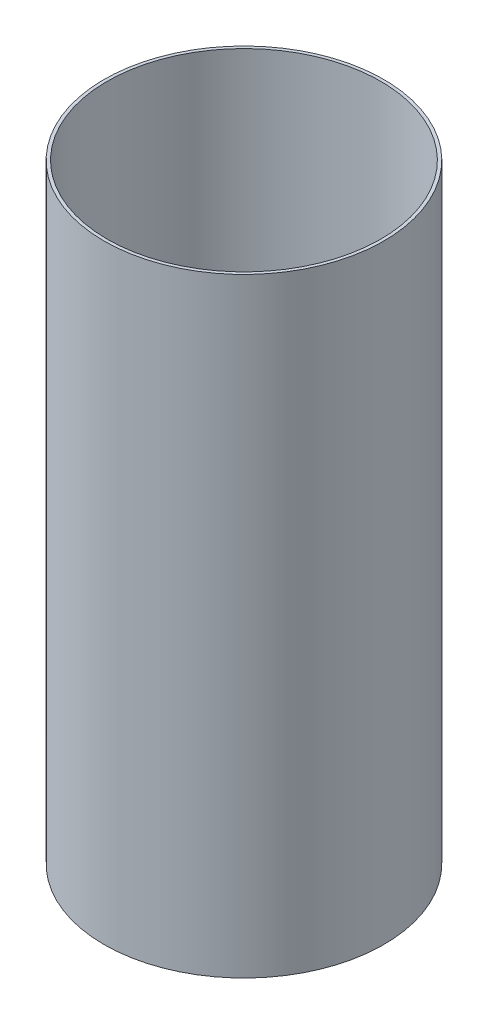
ISO-10303-21;
HEADER;
FILE_DESCRIPTION(('STEP AP214'),'2;1');
FILE_NAME('part.step','',(''),(''),'','','');
FILE_SCHEMA(('AUTOMOTIVE_DESIGN { 1 0 10303 214 1 1 1 1 }'));
ENDSEC;
DATA;
#1=APPLICATION_CONTEXT('core data for automotive mechanical design processes');
#2=APPLICATION_PROTOCOL_DEFINITION('international standard','automotive_design',2000,#1);
#3=PRODUCT_CONTEXT('',#1,'mechanical');
#4=PRODUCT('Part','Part','',(#3));
#5=PRODUCT_RELATED_PRODUCT_CATEGORY('part','',(#4));
#6=PRODUCT_DEFINITION_FORMATION('','',#4);
#7=PRODUCT_DEFINITION_CONTEXT('part definition',#1,'design');
#8=PRODUCT_DEFINITION('design','',#6,#7);
#9=PRODUCT_DEFINITION_SHAPE('','',#8);
#10=(LENGTH_UNIT() NAMED_UNIT(*) SI_UNIT(.MILLI.,.METRE.));
#11=(NAMED_UNIT(*) PLANE_ANGLE_UNIT() SI_UNIT($,.RADIAN.));
#12=(NAMED_UNIT(*) SI_UNIT($,.STERADIAN.) SOLID_ANGLE_UNIT());
#13=UNCERTAINTY_MEASURE_WITH_UNIT(LENGTH_MEASURE(1.E-05),#10,'distance_accuracy_value','');
#14=(GEOMETRIC_REPRESENTATION_CONTEXT(3) GLOBAL_UNCERTAINTY_ASSIGNED_CONTEXT((#13)) GLOBAL_UNIT_ASSIGNED_CONTEXT((#10,
#11,#12)) REPRESENTATION_CONTEXT('',''));
#15=CARTESIAN_POINT('',(0.,0.,0.));
#16=DIRECTION('',(0.,0.,1.));
#17=DIRECTION('',(1.,0.,0.));
#18=AXIS2_PLACEMENT_3D('',#15,#16,#17);
#19=CARTESIAN_POINT('',(0.,98.,0.));
#20=DIRECTION('',(0.,-1.,0.));
#21=DIRECTION('',(0.,0.,-1.));
#22=AXIS2_PLACEMENT_3D('',#19,#20,#21);
#23=CYLINDRICAL_SURFACE('',#22,22.);
#24=CARTESIAN_POINT('',(0.,98.,0.));
#25=DIRECTION('',(0.,1.,0.));
#26=DIRECTION('',(0.,0.,1.));
#27=AXIS2_PLACEMENT_3D('',#24,#25,#26);
#28=CIRCLE('',#27,22.);
#29=CARTESIAN_POINT('',(0.,98.,22.));
#30=VERTEX_POINT('',#29);
#31=EDGE_CURVE('E42',#30,#30,#28,.T.);
#32=ORIENTED_EDGE('',*,*,#31,.T.);
#33=EDGE_LOOP('',(#32));
#34=FACE_BOUND('',#33,.T.);
#35=CARTESIAN_POINT('',(0.,0.,0.));
#36=DIRECTION('',(0.,1.,0.));
#37=DIRECTION('',(0.,0.,1.));
#38=AXIS2_PLACEMENT_3D('',#35,#36,#37);
#39=CIRCLE('',#38,22.);
#40=CARTESIAN_POINT('',(0.,0.,22.));
#41=VERTEX_POINT('',#40);
#42=EDGE_CURVE('E48',#41,#41,#39,.T.);
#43=ORIENTED_EDGE('',*,*,#42,.F.);
#44=EDGE_LOOP('',(#43));
#45=FACE_BOUND('',#44,.T.);
#46=ADVANCED_FACE('F35',(#34,#45),#23,.F.);
#47=CARTESIAN_POINT('',(0.,98.,0.));
#48=DIRECTION('',(0.,-1.,0.));
#49=DIRECTION('',(0.,0.,-1.));
#50=AXIS2_PLACEMENT_3D('',#47,#48,#49);
#51=CYLINDRICAL_SURFACE('',#50,22.5);
#52=CARTESIAN_POINT('',(0.,98.,0.));
#53=DIRECTION('',(0.,1.,0.));
#54=DIRECTION('',(0.,0.,1.));
#55=AXIS2_PLACEMENT_3D('',#52,#53,#54);
#56=CIRCLE('',#55,22.5);
#57=CARTESIAN_POINT('',(0.,98.,22.5));
#58=VERTEX_POINT('',#57);
#59=EDGE_CURVE('E10',#58,#58,#56,.T.);
#60=ORIENTED_EDGE('',*,*,#59,.F.);
#61=EDGE_LOOP('',(#60));
#62=FACE_BOUND('',#61,.T.);
#63=CARTESIAN_POINT('',(0.,0.,0.));
#64=DIRECTION('',(0.,1.,0.));
#65=DIRECTION('',(0.,0.,1.));
#66=AXIS2_PLACEMENT_3D('',#63,#64,#65);
#67=CIRCLE('',#66,22.5);
#68=CARTESIAN_POINT('',(0.,0.,22.5));
#69=VERTEX_POINT('',#68);
#70=EDGE_CURVE('E38',#69,#69,#67,.T.);
#71=ORIENTED_EDGE('',*,*,#70,.T.);
#72=EDGE_LOOP('',(#71));
#73=FACE_BOUND('',#72,.T.);
#74=ADVANCED_FACE('F55',(#62,#73),#51,.T.);
#75=CARTESIAN_POINT('',(0.,98.,0.));
#76=DIRECTION('',(0.,1.,0.));
#77=DIRECTION('',(0.,0.,1.));
#78=AXIS2_PLACEMENT_3D('',#75,#76,#77);
#79=PLANE('',#78);
#80=ORIENTED_EDGE('',*,*,#31,.F.);
#81=EDGE_LOOP('',(#80));
#82=FACE_BOUND('',#81,.T.);
#83=ORIENTED_EDGE('',*,*,#59,.T.);
#84=EDGE_LOOP('',(#83));
#85=FACE_BOUND('',#84,.T.);
#86=ADVANCED_FACE('F59',(#82,#85),#79,.T.);
#87=CARTESIAN_POINT('',(0.,0.,0.));
#88=DIRECTION('',(0.,1.,0.));
#89=DIRECTION('',(0.,0.,1.));
#90=AXIS2_PLACEMENT_3D('',#87,#88,#89);
#91=PLANE('',#90);
#92=ORIENTED_EDGE('',*,*,#42,.T.);
#93=EDGE_LOOP('',(#92));
#94=FACE_BOUND('',#93,.T.);
#95=ORIENTED_EDGE('',*,*,#70,.F.);
#96=EDGE_LOOP('',(#95));
#97=FACE_BOUND('',#96,.T.);
#98=ADVANCED_FACE('F57',(#94,#97),#91,.F.);
#99=CLOSED_SHELL('',(#46,#74,#86,#98));
#100=MANIFOLD_SOLID_BREP('B2',#99);
#101=ADVANCED_BREP_SHAPE_REPRESENTATION('',(#18,#100),#14);
#102=SHAPE_DEFINITION_REPRESENTATION(#9,#101);
ENDSEC;
END-ISO-10303-21;
